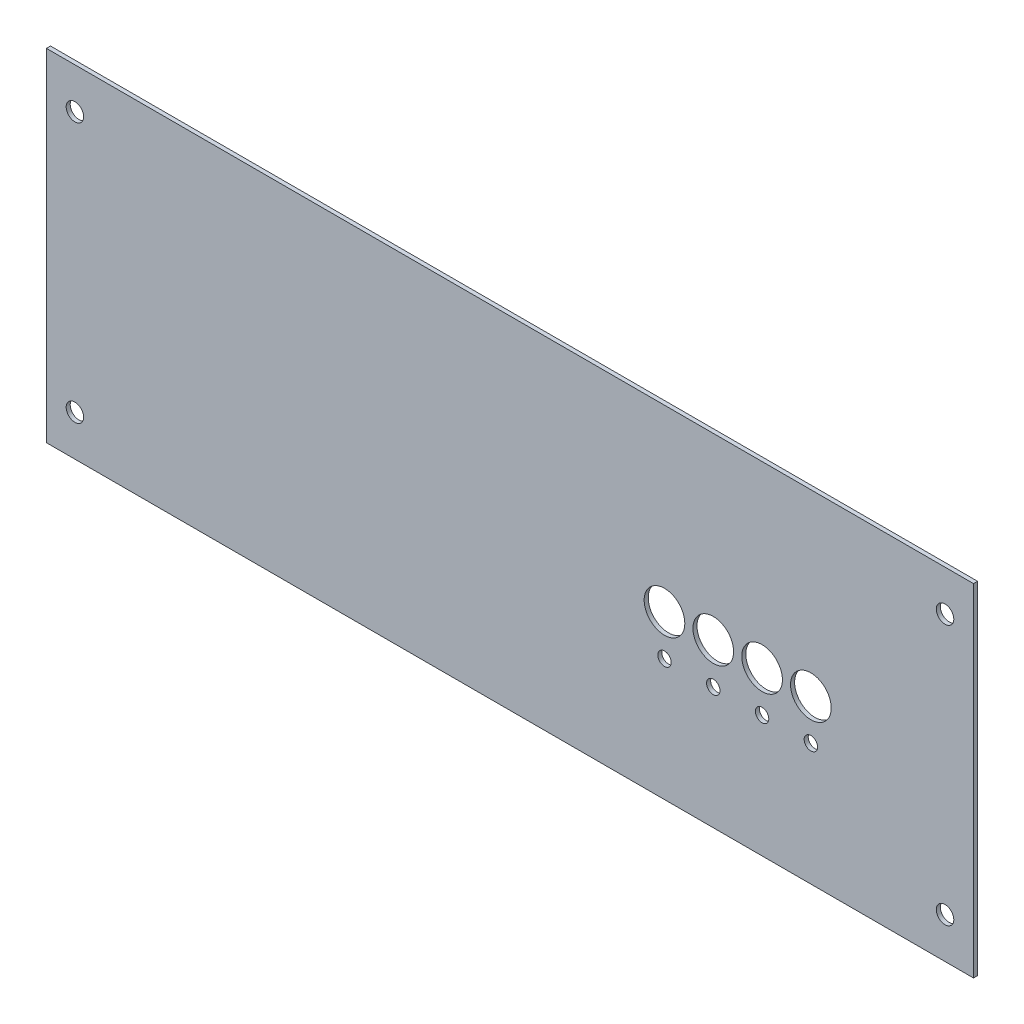
ISO-10303-21;
HEADER;
FILE_DESCRIPTION(('STEP AP214'),'2;1');
FILE_NAME('part.step','',(''),(''),'','','');
FILE_SCHEMA(('AUTOMOTIVE_DESIGN { 1 0 10303 214 1 1 1 1 }'));
ENDSEC;
DATA;
#1=APPLICATION_CONTEXT('core data for automotive mechanical design processes');
#2=APPLICATION_PROTOCOL_DEFINITION('international standard','automotive_design',2000,#1);
#3=PRODUCT_CONTEXT('',#1,'mechanical');
#4=PRODUCT('Part','Part','',(#3));
#5=PRODUCT_RELATED_PRODUCT_CATEGORY('part','',(#4));
#6=PRODUCT_DEFINITION_FORMATION('','',#4);
#7=PRODUCT_DEFINITION_CONTEXT('part definition',#1,'design');
#8=PRODUCT_DEFINITION('design','',#6,#7);
#9=PRODUCT_DEFINITION_SHAPE('','',#8);
#10=(LENGTH_UNIT() NAMED_UNIT(*) SI_UNIT(.MILLI.,.METRE.));
#11=(NAMED_UNIT(*) PLANE_ANGLE_UNIT() SI_UNIT($,.RADIAN.));
#12=(NAMED_UNIT(*) SI_UNIT($,.STERADIAN.) SOLID_ANGLE_UNIT());
#13=UNCERTAINTY_MEASURE_WITH_UNIT(LENGTH_MEASURE(1.E-05),#10,'distance_accuracy_value','');
#14=(GEOMETRIC_REPRESENTATION_CONTEXT(3) GLOBAL_UNCERTAINTY_ASSIGNED_CONTEXT((#13)) GLOBAL_UNIT_ASSIGNED_CONTEXT((#10,
#11,#12)) REPRESENTATION_CONTEXT('',''));
#15=CARTESIAN_POINT('',(0.,0.,0.));
#16=DIRECTION('',(0.,0.,1.));
#17=DIRECTION('',(1.,0.,0.));
#18=AXIS2_PLACEMENT_3D('',#15,#16,#17);
#19=CARTESIAN_POINT('',(-114.,-42.,1.));
#20=DIRECTION('',(0.,0.,-1.));
#21=DIRECTION('',(-1.,0.,0.));
#22=AXIS2_PLACEMENT_3D('',#19,#20,#21);
#23=PLANE('',#22);
#24=CARTESIAN_POINT('',(-107.,-32.,1.));
#25=DIRECTION('',(0.,0.,1.));
#26=DIRECTION('',(1.,0.,0.));
#27=AXIS2_PLACEMENT_3D('',#24,#25,#26);
#28=CIRCLE('',#27,2.15);
#29=CARTESIAN_POINT('',(-104.85,-32.,1.));
#30=VERTEX_POINT('',#29);
#31=EDGE_CURVE('E167',#30,#30,#28,.T.);
#32=ORIENTED_EDGE('',*,*,#31,.F.);
#33=EDGE_LOOP('',(#32));
#34=FACE_BOUND('',#33,.T.);
#35=CARTESIAN_POINT('',(107.,32.,1.));
#36=DIRECTION('',(0.,0.,1.));
#37=DIRECTION('',(1.,0.,0.));
#38=AXIS2_PLACEMENT_3D('',#35,#36,#37);
#39=CIRCLE('',#38,2.15);
#40=CARTESIAN_POINT('',(109.15,32.,1.));
#41=VERTEX_POINT('',#40);
#42=EDGE_CURVE('E155',#41,#41,#39,.T.);
#43=ORIENTED_EDGE('',*,*,#42,.F.);
#44=EDGE_LOOP('',(#43));
#45=FACE_BOUND('',#44,.T.);
#46=CARTESIAN_POINT('',(38.,-2.,1.));
#47=DIRECTION('',(0.,0.,1.));
#48=DIRECTION('',(1.,0.,0.));
#49=AXIS2_PLACEMENT_3D('',#46,#47,#48);
#50=CIRCLE('',#49,5.);
#51=CARTESIAN_POINT('',(43.,-2.,1.));
#52=VERTEX_POINT('',#51);
#53=EDGE_CURVE('E143',#52,#52,#50,.T.);
#54=ORIENTED_EDGE('',*,*,#53,.F.);
#55=EDGE_LOOP('',(#54));
#56=FACE_BOUND('',#55,.T.);
#57=CARTESIAN_POINT('',(50.,-2.,1.));
#58=DIRECTION('',(0.,0.,1.));
#59=DIRECTION('',(1.,0.,0.));
#60=AXIS2_PLACEMENT_3D('',#57,#58,#59);
#61=CIRCLE('',#60,5.);
#62=CARTESIAN_POINT('',(55.,-2.,1.));
#63=VERTEX_POINT('',#62);
#64=EDGE_CURVE('E131',#63,#63,#61,.T.);
#65=ORIENTED_EDGE('',*,*,#64,.F.);
#66=EDGE_LOOP('',(#65));
#67=FACE_BOUND('',#66,.T.);
#68=CARTESIAN_POINT('',(62.,-2.,1.));
#69=DIRECTION('',(0.,0.,1.));
#70=DIRECTION('',(1.,0.,0.));
#71=AXIS2_PLACEMENT_3D('',#68,#69,#70);
#72=CIRCLE('',#71,5.);
#73=CARTESIAN_POINT('',(67.,-2.,1.));
#74=VERTEX_POINT('',#73);
#75=EDGE_CURVE('E119',#74,#74,#72,.T.);
#76=ORIENTED_EDGE('',*,*,#75,.F.);
#77=EDGE_LOOP('',(#76));
#78=FACE_BOUND('',#77,.T.);
#79=CARTESIAN_POINT('',(74.,-2.,1.));
#80=DIRECTION('',(0.,0.,1.));
#81=DIRECTION('',(1.,0.,0.));
#82=AXIS2_PLACEMENT_3D('',#79,#80,#81);
#83=CIRCLE('',#82,5.);
#84=CARTESIAN_POINT('',(79.,-2.,1.));
#85=VERTEX_POINT('',#84);
#86=EDGE_CURVE('E98',#85,#85,#83,.T.);
#87=ORIENTED_EDGE('',*,*,#86,.F.);
#88=EDGE_LOOP('',(#87));
#89=FACE_BOUND('',#88,.T.);
#90=DIRECTION('',(0.,-1.,0.));
#91=VECTOR('',#90,1.);
#92=CARTESIAN_POINT('',(-114.,-42.,1.));
#93=LINE('',#92,#91);
#94=CARTESIAN_POINT('',(-114.,42.,1.));
#95=VERTEX_POINT('',#94);
#96=CARTESIAN_POINT('',(-114.,-42.,1.));
#97=VERTEX_POINT('',#96);
#98=EDGE_CURVE('E83',#95,#97,#93,.T.);
#99=ORIENTED_EDGE('',*,*,#98,.T.);
#100=DIRECTION('',(1.,0.,0.));
#101=VECTOR('',#100,1.);
#102=CARTESIAN_POINT('',(-114.,-42.,1.));
#103=LINE('',#102,#101);
#104=CARTESIAN_POINT('',(114.,-42.,1.));
#105=VERTEX_POINT('',#104);
#106=EDGE_CURVE('E78',#97,#105,#103,.T.);
#107=ORIENTED_EDGE('',*,*,#106,.T.);
#108=DIRECTION('',(0.,1.,0.));
#109=VECTOR('',#108,1.);
#110=CARTESIAN_POINT('',(114.,-42.,1.));
#111=LINE('',#110,#109);
#112=CARTESIAN_POINT('',(114.,42.,1.));
#113=VERTEX_POINT('',#112);
#114=EDGE_CURVE('E81',#105,#113,#111,.T.);
#115=ORIENTED_EDGE('',*,*,#114,.T.);
#116=DIRECTION('',(-1.,0.,0.));
#117=VECTOR('',#116,1.);
#118=CARTESIAN_POINT('',(-114.,42.,1.));
#119=LINE('',#118,#117);
#120=EDGE_CURVE('E48',#113,#95,#119,.T.);
#121=ORIENTED_EDGE('',*,*,#120,.T.);
#122=EDGE_LOOP('',(#99,#107,#115,#121));
#123=FACE_BOUND('',#122,.T.);
#124=CARTESIAN_POINT('',(74.,-12.,1.));
#125=DIRECTION('',(0.,0.,1.));
#126=DIRECTION('',(1.,0.,0.));
#127=AXIS2_PLACEMENT_3D('',#124,#125,#126);
#128=CIRCLE('',#127,1.65);
#129=CARTESIAN_POINT('',(75.65,-12.,1.));
#130=VERTEX_POINT('',#129);
#131=EDGE_CURVE('E113',#130,#130,#128,.T.);
#132=ORIENTED_EDGE('',*,*,#131,.F.);
#133=EDGE_LOOP('',(#132));
#134=FACE_BOUND('',#133,.T.);
#135=CARTESIAN_POINT('',(62.,-12.,1.));
#136=DIRECTION('',(0.,0.,1.));
#137=DIRECTION('',(1.,0.,0.));
#138=AXIS2_PLACEMENT_3D('',#135,#136,#137);
#139=CIRCLE('',#138,1.65);
#140=CARTESIAN_POINT('',(63.65,-12.,1.));
#141=VERTEX_POINT('',#140);
#142=EDGE_CURVE('E125',#141,#141,#139,.T.);
#143=ORIENTED_EDGE('',*,*,#142,.F.);
#144=EDGE_LOOP('',(#143));
#145=FACE_BOUND('',#144,.T.);
#146=CARTESIAN_POINT('',(50.,-12.,1.));
#147=DIRECTION('',(0.,0.,1.));
#148=DIRECTION('',(1.,0.,0.));
#149=AXIS2_PLACEMENT_3D('',#146,#147,#148);
#150=CIRCLE('',#149,1.65);
#151=CARTESIAN_POINT('',(51.65,-12.,1.));
#152=VERTEX_POINT('',#151);
#153=EDGE_CURVE('E137',#152,#152,#150,.T.);
#154=ORIENTED_EDGE('',*,*,#153,.F.);
#155=EDGE_LOOP('',(#154));
#156=FACE_BOUND('',#155,.T.);
#157=CARTESIAN_POINT('',(38.,-12.,1.));
#158=DIRECTION('',(0.,0.,1.));
#159=DIRECTION('',(1.,0.,0.));
#160=AXIS2_PLACEMENT_3D('',#157,#158,#159);
#161=CIRCLE('',#160,1.65);
#162=CARTESIAN_POINT('',(39.65,-12.,1.));
#163=VERTEX_POINT('',#162);
#164=EDGE_CURVE('E149',#163,#163,#161,.T.);
#165=ORIENTED_EDGE('',*,*,#164,.F.);
#166=EDGE_LOOP('',(#165));
#167=FACE_BOUND('',#166,.T.);
#168=CARTESIAN_POINT('',(-107.,32.,1.));
#169=DIRECTION('',(0.,0.,1.));
#170=DIRECTION('',(-1.,0.,0.));
#171=AXIS2_PLACEMENT_3D('',#168,#169,#170);
#172=CIRCLE('',#171,2.15);
#173=CARTESIAN_POINT('',(-109.15,32.,1.));
#174=VERTEX_POINT('',#173);
#175=EDGE_CURVE('E161',#174,#174,#172,.T.);
#176=ORIENTED_EDGE('',*,*,#175,.F.);
#177=EDGE_LOOP('',(#176));
#178=FACE_BOUND('',#177,.T.);
#179=CARTESIAN_POINT('',(107.,-32.,1.));
#180=DIRECTION('',(0.,0.,1.));
#181=DIRECTION('',(-1.,0.,0.));
#182=AXIS2_PLACEMENT_3D('',#179,#180,#181);
#183=CIRCLE('',#182,2.15);
#184=CARTESIAN_POINT('',(104.85,-32.,1.));
#185=VERTEX_POINT('',#184);
#186=EDGE_CURVE('E173',#185,#185,#183,.T.);
#187=ORIENTED_EDGE('',*,*,#186,.F.);
#188=EDGE_LOOP('',(#187));
#189=FACE_BOUND('',#188,.T.);
#190=ADVANCED_FACE('F31',(#34,#45,#56,#67,#78,#89,#123,#134,#145,#156,#167,#178,#189),#23,.F.);
#191=CARTESIAN_POINT('',(-114.,-42.,0.));
#192=DIRECTION('',(0.,0.,-1.));
#193=DIRECTION('',(-1.,0.,0.));
#194=AXIS2_PLACEMENT_3D('',#191,#192,#193);
#195=PLANE('',#194);
#196=CARTESIAN_POINT('',(-107.,-32.,0.));
#197=DIRECTION('',(0.,0.,1.));
#198=DIRECTION('',(1.,0.,0.));
#199=AXIS2_PLACEMENT_3D('',#196,#197,#198);
#200=CIRCLE('',#199,2.15);
#201=CARTESIAN_POINT('',(-104.85,-32.,0.));
#202=VERTEX_POINT('',#201);
#203=EDGE_CURVE('E170',#202,#202,#200,.T.);
#204=ORIENTED_EDGE('',*,*,#203,.T.);
#205=EDGE_LOOP('',(#204));
#206=FACE_BOUND('',#205,.T.);
#207=CARTESIAN_POINT('',(107.,32.,0.));
#208=DIRECTION('',(0.,0.,1.));
#209=DIRECTION('',(1.,0.,0.));
#210=AXIS2_PLACEMENT_3D('',#207,#208,#209);
#211=CIRCLE('',#210,2.15);
#212=CARTESIAN_POINT('',(109.15,32.,0.));
#213=VERTEX_POINT('',#212);
#214=EDGE_CURVE('E158',#213,#213,#211,.T.);
#215=ORIENTED_EDGE('',*,*,#214,.T.);
#216=EDGE_LOOP('',(#215));
#217=FACE_BOUND('',#216,.T.);
#218=CARTESIAN_POINT('',(38.,-2.,0.));
#219=DIRECTION('',(0.,0.,1.));
#220=DIRECTION('',(1.,0.,0.));
#221=AXIS2_PLACEMENT_3D('',#218,#219,#220);
#222=CIRCLE('',#221,5.);
#223=CARTESIAN_POINT('',(43.,-2.,0.));
#224=VERTEX_POINT('',#223);
#225=EDGE_CURVE('E146',#224,#224,#222,.T.);
#226=ORIENTED_EDGE('',*,*,#225,.T.);
#227=EDGE_LOOP('',(#226));
#228=FACE_BOUND('',#227,.T.);
#229=CARTESIAN_POINT('',(50.,-2.,0.));
#230=DIRECTION('',(0.,0.,1.));
#231=DIRECTION('',(1.,0.,0.));
#232=AXIS2_PLACEMENT_3D('',#229,#230,#231);
#233=CIRCLE('',#232,5.);
#234=CARTESIAN_POINT('',(55.,-2.,0.));
#235=VERTEX_POINT('',#234);
#236=EDGE_CURVE('E134',#235,#235,#233,.T.);
#237=ORIENTED_EDGE('',*,*,#236,.T.);
#238=EDGE_LOOP('',(#237));
#239=FACE_BOUND('',#238,.T.);
#240=CARTESIAN_POINT('',(62.,-2.,0.));
#241=DIRECTION('',(0.,0.,1.));
#242=DIRECTION('',(1.,0.,0.));
#243=AXIS2_PLACEMENT_3D('',#240,#241,#242);
#244=CIRCLE('',#243,5.);
#245=CARTESIAN_POINT('',(67.,-2.,0.));
#246=VERTEX_POINT('',#245);
#247=EDGE_CURVE('E122',#246,#246,#244,.T.);
#248=ORIENTED_EDGE('',*,*,#247,.T.);
#249=EDGE_LOOP('',(#248));
#250=FACE_BOUND('',#249,.T.);
#251=CARTESIAN_POINT('',(74.,-2.,0.));
#252=DIRECTION('',(0.,0.,1.));
#253=DIRECTION('',(1.,0.,0.));
#254=AXIS2_PLACEMENT_3D('',#251,#252,#253);
#255=CIRCLE('',#254,5.);
#256=CARTESIAN_POINT('',(79.,-2.,0.));
#257=VERTEX_POINT('',#256);
#258=EDGE_CURVE('E110',#257,#257,#255,.T.);
#259=ORIENTED_EDGE('',*,*,#258,.T.);
#260=EDGE_LOOP('',(#259));
#261=FACE_BOUND('',#260,.T.);
#262=DIRECTION('',(0.,-1.,0.));
#263=VECTOR('',#262,1.);
#264=CARTESIAN_POINT('',(-114.,-42.,0.));
#265=LINE('',#264,#263);
#266=CARTESIAN_POINT('',(-114.,42.,0.));
#267=VERTEX_POINT('',#266);
#268=CARTESIAN_POINT('',(-114.,-42.,0.));
#269=VERTEX_POINT('',#268);
#270=EDGE_CURVE('E95',#267,#269,#265,.T.);
#271=ORIENTED_EDGE('',*,*,#270,.F.);
#272=DIRECTION('',(-1.,0.,0.));
#273=VECTOR('',#272,1.);
#274=CARTESIAN_POINT('',(-114.,42.,0.));
#275=LINE('',#274,#273);
#276=CARTESIAN_POINT('',(114.,42.,0.));
#277=VERTEX_POINT('',#276);
#278=EDGE_CURVE('E71',#277,#267,#275,.T.);
#279=ORIENTED_EDGE('',*,*,#278,.F.);
#280=DIRECTION('',(0.,1.,0.));
#281=VECTOR('',#280,1.);
#282=CARTESIAN_POINT('',(114.,-42.,0.));
#283=LINE('',#282,#281);
#284=CARTESIAN_POINT('',(114.,-42.,0.));
#285=VERTEX_POINT('',#284);
#286=EDGE_CURVE('E65',#285,#277,#283,.T.);
#287=ORIENTED_EDGE('',*,*,#286,.F.);
#288=DIRECTION('',(1.,0.,0.));
#289=VECTOR('',#288,1.);
#290=CARTESIAN_POINT('',(-114.,-42.,0.));
#291=LINE('',#290,#289);
#292=EDGE_CURVE('E87',#269,#285,#291,.T.);
#293=ORIENTED_EDGE('',*,*,#292,.F.);
#294=EDGE_LOOP('',(#271,#279,#287,#293));
#295=FACE_BOUND('',#294,.T.);
#296=CARTESIAN_POINT('',(74.,-12.,0.));
#297=DIRECTION('',(0.,0.,1.));
#298=DIRECTION('',(1.,0.,0.));
#299=AXIS2_PLACEMENT_3D('',#296,#297,#298);
#300=CIRCLE('',#299,1.65);
#301=CARTESIAN_POINT('',(75.65,-12.,0.));
#302=VERTEX_POINT('',#301);
#303=EDGE_CURVE('E116',#302,#302,#300,.T.);
#304=ORIENTED_EDGE('',*,*,#303,.T.);
#305=EDGE_LOOP('',(#304));
#306=FACE_BOUND('',#305,.T.);
#307=CARTESIAN_POINT('',(62.,-12.,0.));
#308=DIRECTION('',(0.,0.,1.));
#309=DIRECTION('',(1.,0.,0.));
#310=AXIS2_PLACEMENT_3D('',#307,#308,#309);
#311=CIRCLE('',#310,1.65);
#312=CARTESIAN_POINT('',(63.65,-12.,0.));
#313=VERTEX_POINT('',#312);
#314=EDGE_CURVE('E128',#313,#313,#311,.T.);
#315=ORIENTED_EDGE('',*,*,#314,.T.);
#316=EDGE_LOOP('',(#315));
#317=FACE_BOUND('',#316,.T.);
#318=CARTESIAN_POINT('',(50.,-12.,0.));
#319=DIRECTION('',(0.,0.,1.));
#320=DIRECTION('',(1.,0.,0.));
#321=AXIS2_PLACEMENT_3D('',#318,#319,#320);
#322=CIRCLE('',#321,1.65);
#323=CARTESIAN_POINT('',(51.65,-12.,0.));
#324=VERTEX_POINT('',#323);
#325=EDGE_CURVE('E140',#324,#324,#322,.T.);
#326=ORIENTED_EDGE('',*,*,#325,.T.);
#327=EDGE_LOOP('',(#326));
#328=FACE_BOUND('',#327,.T.);
#329=CARTESIAN_POINT('',(38.,-12.,0.));
#330=DIRECTION('',(0.,0.,1.));
#331=DIRECTION('',(1.,0.,0.));
#332=AXIS2_PLACEMENT_3D('',#329,#330,#331);
#333=CIRCLE('',#332,1.65);
#334=CARTESIAN_POINT('',(39.65,-12.,0.));
#335=VERTEX_POINT('',#334);
#336=EDGE_CURVE('E152',#335,#335,#333,.T.);
#337=ORIENTED_EDGE('',*,*,#336,.T.);
#338=EDGE_LOOP('',(#337));
#339=FACE_BOUND('',#338,.T.);
#340=CARTESIAN_POINT('',(-107.,32.,0.));
#341=DIRECTION('',(0.,0.,1.));
#342=DIRECTION('',(-1.,0.,0.));
#343=AXIS2_PLACEMENT_3D('',#340,#341,#342);
#344=CIRCLE('',#343,2.15);
#345=CARTESIAN_POINT('',(-109.15,32.,0.));
#346=VERTEX_POINT('',#345);
#347=EDGE_CURVE('E164',#346,#346,#344,.T.);
#348=ORIENTED_EDGE('',*,*,#347,.T.);
#349=EDGE_LOOP('',(#348));
#350=FACE_BOUND('',#349,.T.);
#351=CARTESIAN_POINT('',(107.,-32.,0.));
#352=DIRECTION('',(0.,0.,1.));
#353=DIRECTION('',(-1.,0.,0.));
#354=AXIS2_PLACEMENT_3D('',#351,#352,#353);
#355=CIRCLE('',#354,2.15);
#356=CARTESIAN_POINT('',(104.85,-32.,0.));
#357=VERTEX_POINT('',#356);
#358=EDGE_CURVE('E176',#357,#357,#355,.T.);
#359=ORIENTED_EDGE('',*,*,#358,.T.);
#360=EDGE_LOOP('',(#359));
#361=FACE_BOUND('',#360,.T.);
#362=ADVANCED_FACE('F106',(#206,#217,#228,#239,#250,#261,#295,#306,#317,#328,#339,#350,#361),
#195,.T.);
#363=CARTESIAN_POINT('',(-114.,-42.,1.));
#364=DIRECTION('',(1.,0.,0.));
#365=DIRECTION('',(0.,0.,-1.));
#366=AXIS2_PLACEMENT_3D('',#363,#364,#365);
#367=PLANE('',#366);
#368=ORIENTED_EDGE('',*,*,#270,.T.);
#369=DIRECTION('',(0.,0.,-1.));
#370=VECTOR('',#369,1.);
#371=CARTESIAN_POINT('',(-114.,-42.,1.));
#372=LINE('',#371,#370);
#373=EDGE_CURVE('E11',#97,#269,#372,.T.);
#374=ORIENTED_EDGE('',*,*,#373,.F.);
#375=ORIENTED_EDGE('',*,*,#98,.F.);
#376=DIRECTION('',(0.,0.,-1.));
#377=VECTOR('',#376,1.);
#378=CARTESIAN_POINT('',(-114.,42.,1.));
#379=LINE('',#378,#377);
#380=EDGE_CURVE('E91',#95,#267,#379,.T.);
#381=ORIENTED_EDGE('',*,*,#380,.T.);
#382=EDGE_LOOP('',(#368,#374,#375,#381));
#383=FACE_BOUND('',#382,.T.);
#384=ADVANCED_FACE('F33',(#383),#367,.F.);
#385=CARTESIAN_POINT('',(-114.,-42.,1.));
#386=DIRECTION('',(0.,1.,0.));
#387=DIRECTION('',(0.,0.,1.));
#388=AXIS2_PLACEMENT_3D('',#385,#386,#387);
#389=PLANE('',#388);
#390=ORIENTED_EDGE('',*,*,#292,.T.);
#391=DIRECTION('',(0.,0.,-1.));
#392=VECTOR('',#391,1.);
#393=CARTESIAN_POINT('',(114.,-42.,1.));
#394=LINE('',#393,#392);
#395=EDGE_CURVE('E40',#105,#285,#394,.T.);
#396=ORIENTED_EDGE('',*,*,#395,.F.);
#397=ORIENTED_EDGE('',*,*,#106,.F.);
#398=ORIENTED_EDGE('',*,*,#373,.T.);
#399=EDGE_LOOP('',(#390,#396,#397,#398));
#400=FACE_BOUND('',#399,.T.);
#401=ADVANCED_FACE('F86',(#400),#389,.F.);
#402=CARTESIAN_POINT('',(114.,-42.,1.));
#403=DIRECTION('',(-1.,0.,0.));
#404=DIRECTION('',(0.,0.,1.));
#405=AXIS2_PLACEMENT_3D('',#402,#403,#404);
#406=PLANE('',#405);
#407=ORIENTED_EDGE('',*,*,#286,.T.);
#408=DIRECTION('',(0.,0.,-1.));
#409=VECTOR('',#408,1.);
#410=CARTESIAN_POINT('',(114.,42.,1.));
#411=LINE('',#410,#409);
#412=EDGE_CURVE('E88',#113,#277,#411,.T.);
#413=ORIENTED_EDGE('',*,*,#412,.F.);
#414=ORIENTED_EDGE('',*,*,#114,.F.);
#415=ORIENTED_EDGE('',*,*,#395,.T.);
#416=EDGE_LOOP('',(#407,#413,#414,#415));
#417=FACE_BOUND('',#416,.T.);
#418=ADVANCED_FACE('F89',(#417),#406,.F.);
#419=CARTESIAN_POINT('',(-114.,42.,1.));
#420=DIRECTION('',(0.,-1.,0.));
#421=DIRECTION('',(1.,0.,0.));
#422=AXIS2_PLACEMENT_3D('',#419,#420,#421);
#423=PLANE('',#422);
#424=ORIENTED_EDGE('',*,*,#278,.T.);
#425=ORIENTED_EDGE('',*,*,#380,.F.);
#426=ORIENTED_EDGE('',*,*,#120,.F.);
#427=ORIENTED_EDGE('',*,*,#412,.T.);
#428=EDGE_LOOP('',(#424,#425,#426,#427));
#429=FACE_BOUND('',#428,.T.);
#430=ADVANCED_FACE('F103',(#429),#423,.F.);
#431=CARTESIAN_POINT('',(74.,-2.,1.));
#432=DIRECTION('',(0.,0.,-1.));
#433=DIRECTION('',(-1.,0.,0.));
#434=AXIS2_PLACEMENT_3D('',#431,#432,#433);
#435=CYLINDRICAL_SURFACE('',#434,5.);
#436=ORIENTED_EDGE('',*,*,#86,.T.);
#437=EDGE_LOOP('',(#436));
#438=FACE_BOUND('',#437,.T.);
#439=ORIENTED_EDGE('',*,*,#258,.F.);
#440=EDGE_LOOP('',(#439));
#441=FACE_BOUND('',#440,.T.);
#442=ADVANCED_FACE('F196',(#438,#441),#435,.F.);
#443=CARTESIAN_POINT('',(74.,-12.,1.));
#444=DIRECTION('',(0.,0.,-1.));
#445=DIRECTION('',(-1.,0.,0.));
#446=AXIS2_PLACEMENT_3D('',#443,#444,#445);
#447=CYLINDRICAL_SURFACE('',#446,1.65);
#448=ORIENTED_EDGE('',*,*,#131,.T.);
#449=EDGE_LOOP('',(#448));
#450=FACE_BOUND('',#449,.T.);
#451=ORIENTED_EDGE('',*,*,#303,.F.);
#452=EDGE_LOOP('',(#451));
#453=FACE_BOUND('',#452,.T.);
#454=ADVANCED_FACE('F242',(#450,#453),#447,.F.);
#455=CARTESIAN_POINT('',(62.,-2.,1.));
#456=DIRECTION('',(0.,0.,-1.));
#457=DIRECTION('',(-1.,0.,0.));
#458=AXIS2_PLACEMENT_3D('',#455,#456,#457);
#459=CYLINDRICAL_SURFACE('',#458,5.);
#460=ORIENTED_EDGE('',*,*,#75,.T.);
#461=EDGE_LOOP('',(#460));
#462=FACE_BOUND('',#461,.T.);
#463=ORIENTED_EDGE('',*,*,#247,.F.);
#464=EDGE_LOOP('',(#463));
#465=FACE_BOUND('',#464,.T.);
#466=ADVANCED_FACE('F250',(#462,#465),#459,.F.);
#467=CARTESIAN_POINT('',(62.,-12.,1.));
#468=DIRECTION('',(0.,0.,-1.));
#469=DIRECTION('',(-1.,0.,0.));
#470=AXIS2_PLACEMENT_3D('',#467,#468,#469);
#471=CYLINDRICAL_SURFACE('',#470,1.65);
#472=ORIENTED_EDGE('',*,*,#142,.T.);
#473=EDGE_LOOP('',(#472));
#474=FACE_BOUND('',#473,.T.);
#475=ORIENTED_EDGE('',*,*,#314,.F.);
#476=EDGE_LOOP('',(#475));
#477=FACE_BOUND('',#476,.T.);
#478=ADVANCED_FACE('F258',(#474,#477),#471,.F.);
#479=CARTESIAN_POINT('',(50.,-2.,1.));
#480=DIRECTION('',(0.,0.,-1.));
#481=DIRECTION('',(-1.,0.,0.));
#482=AXIS2_PLACEMENT_3D('',#479,#480,#481);
#483=CYLINDRICAL_SURFACE('',#482,5.);
#484=ORIENTED_EDGE('',*,*,#64,.T.);
#485=EDGE_LOOP('',(#484));
#486=FACE_BOUND('',#485,.T.);
#487=ORIENTED_EDGE('',*,*,#236,.F.);
#488=EDGE_LOOP('',(#487));
#489=FACE_BOUND('',#488,.T.);
#490=ADVANCED_FACE('F267',(#486,#489),#483,.F.);
#491=CARTESIAN_POINT('',(50.,-12.,1.));
#492=DIRECTION('',(0.,0.,-1.));
#493=DIRECTION('',(-1.,0.,0.));
#494=AXIS2_PLACEMENT_3D('',#491,#492,#493);
#495=CYLINDRICAL_SURFACE('',#494,1.65);
#496=ORIENTED_EDGE('',*,*,#153,.T.);
#497=EDGE_LOOP('',(#496));
#498=FACE_BOUND('',#497,.T.);
#499=ORIENTED_EDGE('',*,*,#325,.F.);
#500=EDGE_LOOP('',(#499));
#501=FACE_BOUND('',#500,.T.);
#502=ADVANCED_FACE('F276',(#498,#501),#495,.F.);
#503=CARTESIAN_POINT('',(38.,-2.,1.));
#504=DIRECTION('',(0.,0.,-1.));
#505=DIRECTION('',(-1.,0.,0.));
#506=AXIS2_PLACEMENT_3D('',#503,#504,#505);
#507=CYLINDRICAL_SURFACE('',#506,5.);
#508=ORIENTED_EDGE('',*,*,#53,.T.);
#509=EDGE_LOOP('',(#508));
#510=FACE_BOUND('',#509,.T.);
#511=ORIENTED_EDGE('',*,*,#225,.F.);
#512=EDGE_LOOP('',(#511));
#513=FACE_BOUND('',#512,.T.);
#514=ADVANCED_FACE('F285',(#510,#513),#507,.F.);
#515=CARTESIAN_POINT('',(38.,-12.,1.));
#516=DIRECTION('',(0.,0.,-1.));
#517=DIRECTION('',(-1.,0.,0.));
#518=AXIS2_PLACEMENT_3D('',#515,#516,#517);
#519=CYLINDRICAL_SURFACE('',#518,1.65);
#520=ORIENTED_EDGE('',*,*,#164,.T.);
#521=EDGE_LOOP('',(#520));
#522=FACE_BOUND('',#521,.T.);
#523=ORIENTED_EDGE('',*,*,#336,.F.);
#524=EDGE_LOOP('',(#523));
#525=FACE_BOUND('',#524,.T.);
#526=ADVANCED_FACE('F294',(#522,#525),#519,.F.);
#527=CARTESIAN_POINT('',(107.,32.,1.));
#528=DIRECTION('',(0.,0.,-1.));
#529=DIRECTION('',(-1.,0.,0.));
#530=AXIS2_PLACEMENT_3D('',#527,#528,#529);
#531=CYLINDRICAL_SURFACE('',#530,2.15);
#532=ORIENTED_EDGE('',*,*,#42,.T.);
#533=EDGE_LOOP('',(#532));
#534=FACE_BOUND('',#533,.T.);
#535=ORIENTED_EDGE('',*,*,#214,.F.);
#536=EDGE_LOOP('',(#535));
#537=FACE_BOUND('',#536,.T.);
#538=ADVANCED_FACE('F303',(#534,#537),#531,.F.);
#539=CARTESIAN_POINT('',(-107.,32.,1.));
#540=DIRECTION('',(0.,0.,-1.));
#541=DIRECTION('',(-1.,0.,0.));
#542=AXIS2_PLACEMENT_3D('',#539,#540,#541);
#543=CYLINDRICAL_SURFACE('',#542,2.15);
#544=ORIENTED_EDGE('',*,*,#175,.T.);
#545=EDGE_LOOP('',(#544));
#546=FACE_BOUND('',#545,.T.);
#547=ORIENTED_EDGE('',*,*,#347,.F.);
#548=EDGE_LOOP('',(#547));
#549=FACE_BOUND('',#548,.T.);
#550=ADVANCED_FACE('F312',(#546,#549),#543,.F.);
#551=CARTESIAN_POINT('',(-107.,-32.,1.));
#552=DIRECTION('',(0.,0.,-1.));
#553=DIRECTION('',(-1.,0.,0.));
#554=AXIS2_PLACEMENT_3D('',#551,#552,#553);
#555=CYLINDRICAL_SURFACE('',#554,2.15);
#556=ORIENTED_EDGE('',*,*,#31,.T.);
#557=EDGE_LOOP('',(#556));
#558=FACE_BOUND('',#557,.T.);
#559=ORIENTED_EDGE('',*,*,#203,.F.);
#560=EDGE_LOOP('',(#559));
#561=FACE_BOUND('',#560,.T.);
#562=ADVANCED_FACE('F321',(#558,#561),#555,.F.);
#563=CARTESIAN_POINT('',(107.,-32.,1.));
#564=DIRECTION('',(0.,0.,-1.));
#565=DIRECTION('',(-1.,0.,0.));
#566=AXIS2_PLACEMENT_3D('',#563,#564,#565);
#567=CYLINDRICAL_SURFACE('',#566,2.15);
#568=ORIENTED_EDGE('',*,*,#186,.T.);
#569=EDGE_LOOP('',(#568));
#570=FACE_BOUND('',#569,.T.);
#571=ORIENTED_EDGE('',*,*,#358,.F.);
#572=EDGE_LOOP('',(#571));
#573=FACE_BOUND('',#572,.T.);
#574=ADVANCED_FACE('F182',(#570,#573),#567,.F.);
#575=CLOSED_SHELL('',(#190,#362,#384,#401,#418,#430,#442,#454,#466,#478,#490,#502,#514,#526,
#538,#550,#562,#574));
#576=MANIFOLD_SOLID_BREP('B2',#575);
#577=ADVANCED_BREP_SHAPE_REPRESENTATION('',(#18,#576),#14);
#578=SHAPE_DEFINITION_REPRESENTATION(#9,#577);
ENDSEC;
END-ISO-10303-21;
